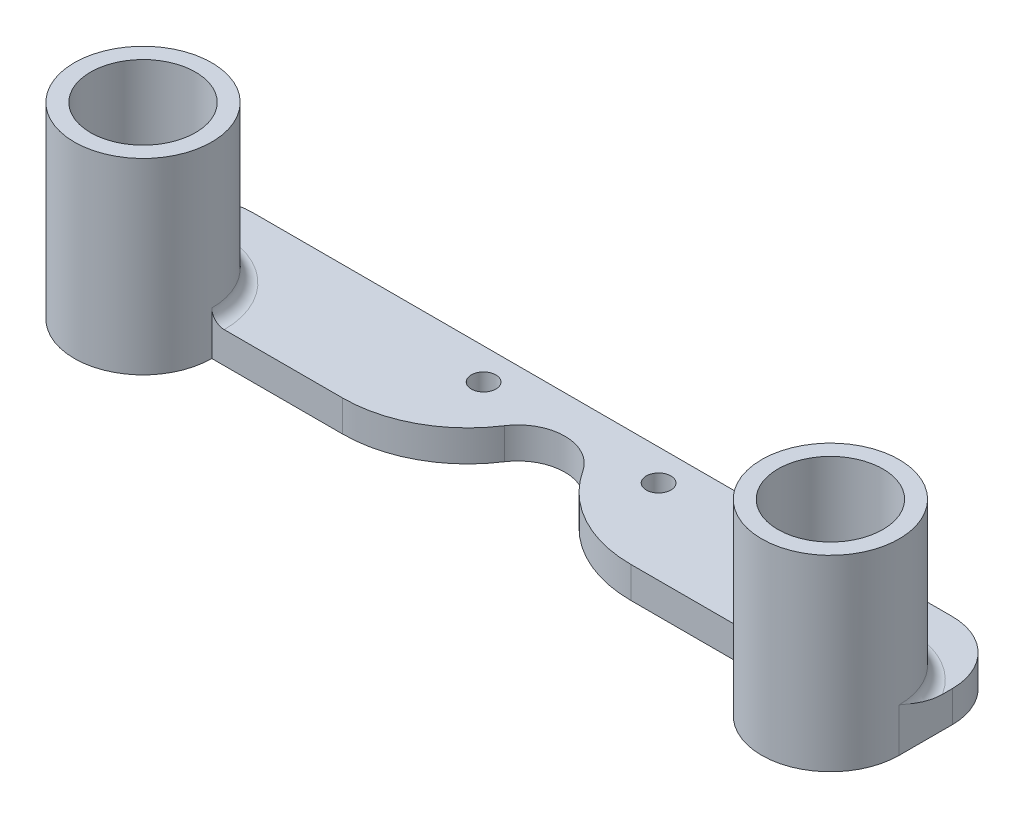
ISO-10303-21;
HEADER;
FILE_DESCRIPTION(('STEP AP214'),'2;1');
FILE_NAME('part.step','',(''),(''),'','','');
FILE_SCHEMA(('AUTOMOTIVE_DESIGN { 1 0 10303 214 1 1 1 1 }'));
ENDSEC;
DATA;
#1=APPLICATION_CONTEXT('core data for automotive mechanical design processes');
#2=APPLICATION_PROTOCOL_DEFINITION('international standard','automotive_design',2000,#1);
#3=PRODUCT_CONTEXT('',#1,'mechanical');
#4=PRODUCT('Part','Part','',(#3));
#5=PRODUCT_RELATED_PRODUCT_CATEGORY('part','',(#4));
#6=PRODUCT_DEFINITION_FORMATION('','',#4);
#7=PRODUCT_DEFINITION_CONTEXT('part definition',#1,'design');
#8=PRODUCT_DEFINITION('design','',#6,#7);
#9=PRODUCT_DEFINITION_SHAPE('','',#8);
#10=(LENGTH_UNIT() NAMED_UNIT(*) SI_UNIT(.MILLI.,.METRE.));
#11=(NAMED_UNIT(*) PLANE_ANGLE_UNIT() SI_UNIT($,.RADIAN.));
#12=(NAMED_UNIT(*) SI_UNIT($,.STERADIAN.) SOLID_ANGLE_UNIT());
#13=UNCERTAINTY_MEASURE_WITH_UNIT(LENGTH_MEASURE(1.E-05),#10,'distance_accuracy_value','');
#14=(GEOMETRIC_REPRESENTATION_CONTEXT(3) GLOBAL_UNCERTAINTY_ASSIGNED_CONTEXT((#13)) GLOBAL_UNIT_ASSIGNED_CONTEXT((#10,
#11,#12)) REPRESENTATION_CONTEXT('',''));
#15=CARTESIAN_POINT('',(0.,0.,0.));
#16=DIRECTION('',(0.,0.,1.));
#17=DIRECTION('',(1.,0.,0.));
#18=AXIS2_PLACEMENT_3D('',#15,#16,#17);
#19=CARTESIAN_POINT('',(45.9292860318092,6.35,-10.795));
#20=DIRECTION('',(0.,-1.,0.));
#21=DIRECTION('',(0.,0.,-1.));
#22=AXIS2_PLACEMENT_3D('',#19,#20,#21);
#23=PLANE('',#22);
#24=CARTESIAN_POINT('',(-7.41071396819081,6.35,-17.145));
#25=DIRECTION('',(0.,1.,0.));
#26=DIRECTION('',(0.,0.,1.));
#27=AXIS2_PLACEMENT_3D('',#24,#25,#26);
#28=CIRCLE('',#27,2.49999999999999);
#29=CARTESIAN_POINT('',(-7.41071396819081,6.35,-14.645));
#30=VERTEX_POINT('',#29);
#31=EDGE_CURVE('E330',#30,#30,#28,.T.);
#32=ORIENTED_EDGE('',*,*,#31,.F.);
#33=EDGE_LOOP('',(#32));
#34=FACE_BOUND('',#33,.T.);
#35=CARTESIAN_POINT('',(-42.9707139681908,6.35,-17.145));
#36=DIRECTION('',(0.,1.,0.));
#37=DIRECTION('',(0.,0.,1.));
#38=AXIS2_PLACEMENT_3D('',#35,#36,#37);
#39=CIRCLE('',#38,2.49999999999999);
#40=CARTESIAN_POINT('',(-42.9707139681908,6.35,-14.645));
#41=VERTEX_POINT('',#40);
#42=EDGE_CURVE('E334',#41,#41,#39,.T.);
#43=ORIENTED_EDGE('',*,*,#42,.F.);
#44=EDGE_LOOP('',(#43));
#45=FACE_BOUND('',#44,.T.);
#46=DIRECTION('',(0.,0.,1.));
#47=VECTOR('',#46,1.);
#48=CARTESIAN_POINT('',(-109.010713968191,6.35,0.));
#49=LINE('',#48,#47);
#50=CARTESIAN_POINT('',(-109.010713968191,6.35,-10.795));
#51=VERTEX_POINT('',#50);
#52=CARTESIAN_POINT('',(-109.010713968191,6.35,-8.79881810244988));
#53=VERTEX_POINT('',#52);
#54=EDGE_CURVE('E302',#51,#53,#49,.T.);
#55=ORIENTED_EDGE('',*,*,#54,.T.);
#56=CARTESIAN_POINT('',(-95.0407139681908,6.35,0.));
#57=DIRECTION('',(0.,-1.,0.));
#58=DIRECTION('',(0.,0.,-1.));
#59=AXIS2_PLACEMENT_3D('',#56,#57,#58);
#60=CIRCLE('',#59,16.51);
#61=CARTESIAN_POINT('',(-78.5307139681908,6.35,0.));
#62=VERTEX_POINT('',#61);
#63=EDGE_CURVE('E174',#53,#62,#60,.T.);
#64=ORIENTED_EDGE('',*,*,#63,.T.);
#65=DIRECTION('',(1.,0.,0.));
#66=VECTOR('',#65,1.);
#67=CARTESIAN_POINT('',(-81.0707139681908,6.35,0.));
#68=LINE('',#67,#66);
#69=CARTESIAN_POINT('',(-54.4627676200957,6.35,0.));
#70=VERTEX_POINT('',#69);
#71=EDGE_CURVE('E321',#62,#70,#68,.T.);
#72=ORIENTED_EDGE('',*,*,#71,.T.);
#73=CARTESIAN_POINT('',(-54.4627676200957,6.35,-25.4));
#74=DIRECTION('',(0.,1.,0.));
#75=DIRECTION('',(0.,0.,-1.));
#76=AXIS2_PLACEMENT_3D('',#73,#74,#75);
#77=CIRCLE('',#76,25.4);
#78=CARTESIAN_POINT('',(-33.1740013278012,6.35,-11.5454545454545));
#79=VERTEX_POINT('',#78);
#80=EDGE_CURVE('E265',#70,#79,#77,.T.);
#81=ORIENTED_EDGE('',*,*,#80,.T.);
#82=CARTESIAN_POINT('',(-25.1907139681908,6.35,-6.35));
#83=DIRECTION('',(0.,-1.,0.));
#84=DIRECTION('',(0.,0.,1.));
#85=AXIS2_PLACEMENT_3D('',#82,#83,#84);
#86=CIRCLE('',#85,9.525);
#87=CARTESIAN_POINT('',(-17.2074266085804,6.35,-11.5454545454545));
#88=VERTEX_POINT('',#87);
#89=EDGE_CURVE('E318',#79,#88,#86,.T.);
#90=ORIENTED_EDGE('',*,*,#89,.T.);
#91=CARTESIAN_POINT('',(4.0813396837141,6.35,-25.4));
#92=DIRECTION('',(0.,1.,0.));
#93=DIRECTION('',(0.,0.,1.));
#94=AXIS2_PLACEMENT_3D('',#91,#92,#93);
#95=CIRCLE('',#94,25.4);
#96=CARTESIAN_POINT('',(4.0813396837141,6.35,0.));
#97=VERTEX_POINT('',#96);
#98=EDGE_CURVE('E316',#88,#97,#95,.T.);
#99=ORIENTED_EDGE('',*,*,#98,.T.);
#100=DIRECTION('',(1.,0.,0.));
#101=VECTOR('',#100,1.);
#102=CARTESIAN_POINT('',(4.08133968371411,6.35,0.));
#103=LINE('',#102,#101);
#104=CARTESIAN_POINT('',(28.1492860318092,6.35,0.));
#105=VERTEX_POINT('',#104);
#106=EDGE_CURVE('E313',#97,#105,#103,.T.);
#107=ORIENTED_EDGE('',*,*,#106,.T.);
#108=CARTESIAN_POINT('',(44.6592860318092,6.35,0.));
#109=DIRECTION('',(0.,-1.,0.));
#110=DIRECTION('',(0.,0.,-1.));
#111=AXIS2_PLACEMENT_3D('',#108,#109,#110);
#112=CIRCLE('',#111,16.51);
#113=CARTESIAN_POINT('',(58.6292860318092,6.35,-8.7988181024499));
#114=VERTEX_POINT('',#113);
#115=EDGE_CURVE('E167',#105,#114,#112,.T.);
#116=ORIENTED_EDGE('',*,*,#115,.T.);
#117=DIRECTION('',(0.,0.,-1.));
#118=VECTOR('',#117,1.);
#119=CARTESIAN_POINT('',(58.6292860318092,6.35,0.));
#120=LINE('',#119,#118);
#121=CARTESIAN_POINT('',(58.6292860318092,6.35,-10.7949999999999));
#122=VERTEX_POINT('',#121);
#123=EDGE_CURVE('E155',#114,#122,#120,.T.);
#124=ORIENTED_EDGE('',*,*,#123,.T.);
#125=CARTESIAN_POINT('',(45.9292860318092,6.35,-10.795));
#126=DIRECTION('',(0.,1.,0.));
#127=DIRECTION('',(0.,0.,-1.));
#128=AXIS2_PLACEMENT_3D('',#125,#126,#127);
#129=CIRCLE('',#128,12.7);
#130=CARTESIAN_POINT('',(45.9292860318091,6.35,-23.495));
#131=VERTEX_POINT('',#130);
#132=EDGE_CURVE('E150',#122,#131,#129,.T.);
#133=ORIENTED_EDGE('',*,*,#132,.T.);
#134=DIRECTION('',(-1.,0.,0.));
#135=VECTOR('',#134,1.);
#136=CARTESIAN_POINT('',(-96.3107139681908,6.35,-23.495));
#137=LINE('',#136,#135);
#138=CARTESIAN_POINT('',(-96.3107139681908,6.35,-23.495));
#139=VERTEX_POINT('',#138);
#140=EDGE_CURVE('E139',#131,#139,#137,.T.);
#141=ORIENTED_EDGE('',*,*,#140,.T.);
#142=CARTESIAN_POINT('',(-96.3107139681908,6.35,-10.795));
#143=DIRECTION('',(0.,1.,0.));
#144=DIRECTION('',(0.,0.,-1.));
#145=AXIS2_PLACEMENT_3D('',#142,#143,#144);
#146=CIRCLE('',#145,12.7);
#147=EDGE_CURVE('E149',#139,#51,#146,.T.);
#148=ORIENTED_EDGE('',*,*,#147,.T.);
#149=EDGE_LOOP('',(#55,#64,#72,#81,#90,#99,#107,#116,#124,#133,#141,#148));
#150=FACE_BOUND('',#149,.T.);
#151=ADVANCED_FACE('F33',(#34,#45,#150),#23,.F.);
#152=CARTESIAN_POINT('',(45.9292860318092,0.,-10.795));
#153=DIRECTION('',(0.,-1.,0.));
#154=DIRECTION('',(0.,0.,-1.));
#155=AXIS2_PLACEMENT_3D('',#152,#153,#154);
#156=PLANE('',#155);
#157=CARTESIAN_POINT('',(-7.41071396819081,0.,-17.145));
#158=DIRECTION('',(0.,1.,0.));
#159=DIRECTION('',(0.,0.,1.));
#160=AXIS2_PLACEMENT_3D('',#157,#158,#159);
#161=CIRCLE('',#160,2.49999999999999);
#162=CARTESIAN_POINT('',(-7.41071396819081,0.,-14.645));
#163=VERTEX_POINT('',#162);
#164=EDGE_CURVE('E331',#163,#163,#161,.T.);
#165=ORIENTED_EDGE('',*,*,#164,.T.);
#166=EDGE_LOOP('',(#165));
#167=FACE_BOUND('',#166,.T.);
#168=CARTESIAN_POINT('',(-95.0407139681908,0.,0.));
#169=DIRECTION('',(0.,1.,0.));
#170=DIRECTION('',(0.,0.,1.));
#171=AXIS2_PLACEMENT_3D('',#168,#169,#170);
#172=CIRCLE('',#171,10.668);
#173=CARTESIAN_POINT('',(-95.0407139681908,0.,10.668));
#174=VERTEX_POINT('',#173);
#175=EDGE_CURVE('E311',#174,#174,#172,.T.);
#176=ORIENTED_EDGE('',*,*,#175,.T.);
#177=EDGE_LOOP('',(#176));
#178=FACE_BOUND('',#177,.T.);
#179=CARTESIAN_POINT('',(45.9292860318092,0.,-10.795));
#180=DIRECTION('',(0.,1.,0.));
#181=DIRECTION('',(0.,0.,-1.));
#182=AXIS2_PLACEMENT_3D('',#179,#180,#181);
#183=CIRCLE('',#182,12.7);
#184=CARTESIAN_POINT('',(58.6292860318092,0.,-10.7949999999999));
#185=VERTEX_POINT('',#184);
#186=CARTESIAN_POINT('',(45.9292860318091,0.,-23.495));
#187=VERTEX_POINT('',#186);
#188=EDGE_CURVE('E163',#185,#187,#183,.T.);
#189=ORIENTED_EDGE('',*,*,#188,.F.);
#190=DIRECTION('',(0.,0.,-1.));
#191=VECTOR('',#190,1.);
#192=CARTESIAN_POINT('',(58.6292860318092,0.,0.));
#193=LINE('',#192,#191);
#194=CARTESIAN_POINT('',(58.6292860318092,0.,0.));
#195=VERTEX_POINT('',#194);
#196=EDGE_CURVE('E159',#195,#185,#193,.T.);
#197=ORIENTED_EDGE('',*,*,#196,.F.);
#198=CARTESIAN_POINT('',(44.6592860318092,0.,0.));
#199=DIRECTION('',(0.,1.,0.));
#200=DIRECTION('',(0.,0.,1.));
#201=AXIS2_PLACEMENT_3D('',#198,#199,#200);
#202=CIRCLE('',#201,13.97);
#203=CARTESIAN_POINT('',(30.6892860318092,0.,0.));
#204=VERTEX_POINT('',#203);
#205=EDGE_CURVE('E280',#204,#195,#202,.T.);
#206=ORIENTED_EDGE('',*,*,#205,.F.);
#207=DIRECTION('',(1.,0.,0.));
#208=VECTOR('',#207,1.);
#209=CARTESIAN_POINT('',(4.08133968371411,0.,0.));
#210=LINE('',#209,#208);
#211=CARTESIAN_POINT('',(4.0813396837141,0.,0.));
#212=VERTEX_POINT('',#211);
#213=EDGE_CURVE('E278',#212,#204,#210,.T.);
#214=ORIENTED_EDGE('',*,*,#213,.F.);
#215=CARTESIAN_POINT('',(4.0813396837141,0.,-25.4));
#216=DIRECTION('',(0.,1.,0.));
#217=DIRECTION('',(0.,0.,1.));
#218=AXIS2_PLACEMENT_3D('',#215,#216,#217);
#219=CIRCLE('',#218,25.4);
#220=CARTESIAN_POINT('',(-17.2074266085804,0.,-11.5454545454545));
#221=VERTEX_POINT('',#220);
#222=EDGE_CURVE('E273',#221,#212,#219,.T.);
#223=ORIENTED_EDGE('',*,*,#222,.F.);
#224=CARTESIAN_POINT('',(-25.1907139681908,0.,-6.35));
#225=DIRECTION('',(0.,-1.,0.));
#226=DIRECTION('',(0.,0.,1.));
#227=AXIS2_PLACEMENT_3D('',#224,#225,#226);
#228=CIRCLE('',#227,9.525);
#229=CARTESIAN_POINT('',(-33.1740013278012,0.,-11.5454545454545));
#230=VERTEX_POINT('',#229);
#231=EDGE_CURVE('E271',#230,#221,#228,.T.);
#232=ORIENTED_EDGE('',*,*,#231,.F.);
#233=CARTESIAN_POINT('',(-54.4627676200957,0.,-25.4));
#234=DIRECTION('',(0.,1.,0.));
#235=DIRECTION('',(0.,0.,-1.));
#236=AXIS2_PLACEMENT_3D('',#233,#234,#235);
#237=CIRCLE('',#236,25.4);
#238=CARTESIAN_POINT('',(-54.4627676200957,0.,0.));
#239=VERTEX_POINT('',#238);
#240=EDGE_CURVE('E260',#239,#230,#237,.T.);
#241=ORIENTED_EDGE('',*,*,#240,.F.);
#242=DIRECTION('',(1.,0.,0.));
#243=VECTOR('',#242,1.);
#244=CARTESIAN_POINT('',(-81.0707139681908,0.,0.));
#245=LINE('',#244,#243);
#246=CARTESIAN_POINT('',(-81.0707139681908,0.,0.));
#247=VERTEX_POINT('',#246);
#248=EDGE_CURVE('E250',#247,#239,#245,.T.);
#249=ORIENTED_EDGE('',*,*,#248,.F.);
#250=CARTESIAN_POINT('',(-95.0407139681908,0.,0.));
#251=DIRECTION('',(0.,1.,0.));
#252=DIRECTION('',(0.,0.,1.));
#253=AXIS2_PLACEMENT_3D('',#250,#251,#252);
#254=CIRCLE('',#253,13.97);
#255=CARTESIAN_POINT('',(-109.010713968191,0.,0.));
#256=VERTEX_POINT('',#255);
#257=EDGE_CURVE('E261',#256,#247,#254,.T.);
#258=ORIENTED_EDGE('',*,*,#257,.F.);
#259=DIRECTION('',(0.,0.,1.));
#260=VECTOR('',#259,1.);
#261=CARTESIAN_POINT('',(-109.010713968191,0.,0.));
#262=LINE('',#261,#260);
#263=CARTESIAN_POINT('',(-109.010713968191,0.,-10.795));
#264=VERTEX_POINT('',#263);
#265=EDGE_CURVE('E301',#264,#256,#262,.T.);
#266=ORIENTED_EDGE('',*,*,#265,.F.);
#267=CARTESIAN_POINT('',(-96.3107139681908,0.,-10.795));
#268=DIRECTION('',(0.,1.,0.));
#269=DIRECTION('',(0.,0.,-1.));
#270=AXIS2_PLACEMENT_3D('',#267,#268,#269);
#271=CIRCLE('',#270,12.7);
#272=CARTESIAN_POINT('',(-96.3107139681908,0.,-23.495));
#273=VERTEX_POINT('',#272);
#274=EDGE_CURVE('E304',#273,#264,#271,.T.);
#275=ORIENTED_EDGE('',*,*,#274,.F.);
#276=DIRECTION('',(-1.,0.,0.));
#277=VECTOR('',#276,1.);
#278=CARTESIAN_POINT('',(-96.3107139681908,0.,-23.495));
#279=LINE('',#278,#277);
#280=EDGE_CURVE('E306',#187,#273,#279,.T.);
#281=ORIENTED_EDGE('',*,*,#280,.F.);
#282=EDGE_LOOP('',(#189,#197,#206,#214,#223,#232,#241,#249,#258,#266,#275,#281));
#283=FACE_BOUND('',#282,.T.);
#284=CARTESIAN_POINT('',(44.6592860318092,0.,0.));
#285=DIRECTION('',(0.,1.,0.));
#286=DIRECTION('',(0.,0.,1.));
#287=AXIS2_PLACEMENT_3D('',#284,#285,#286);
#288=CIRCLE('',#287,10.668);
#289=CARTESIAN_POINT('',(44.6592860318092,0.,10.668));
#290=VERTEX_POINT('',#289);
#291=EDGE_CURVE('E327',#290,#290,#288,.T.);
#292=ORIENTED_EDGE('',*,*,#291,.T.);
#293=EDGE_LOOP('',(#292));
#294=FACE_BOUND('',#293,.T.);
#295=CARTESIAN_POINT('',(-42.9707139681908,0.,-17.145));
#296=DIRECTION('',(0.,1.,0.));
#297=DIRECTION('',(0.,0.,1.));
#298=AXIS2_PLACEMENT_3D('',#295,#296,#297);
#299=CIRCLE('',#298,2.49999999999999);
#300=CARTESIAN_POINT('',(-42.9707139681908,0.,-14.645));
#301=VERTEX_POINT('',#300);
#302=EDGE_CURVE('E337',#301,#301,#299,.T.);
#303=ORIENTED_EDGE('',*,*,#302,.T.);
#304=EDGE_LOOP('',(#303));
#305=FACE_BOUND('',#304,.T.);
#306=ADVANCED_FACE('F202',(#167,#178,#283,#294,#305),#156,.T.);
#307=CARTESIAN_POINT('',(45.9292860318092,6.35,-10.795));
#308=DIRECTION('',(0.,-1.,0.));
#309=DIRECTION('',(0.,0.,-1.));
#310=AXIS2_PLACEMENT_3D('',#307,#308,#309);
#311=CYLINDRICAL_SURFACE('',#310,12.7);
#312=ORIENTED_EDGE('',*,*,#188,.T.);
#313=DIRECTION('',(0.,-1.,0.));
#314=VECTOR('',#313,1.);
#315=CARTESIAN_POINT('',(45.9292860318091,6.35,-23.495));
#316=LINE('',#315,#314);
#317=EDGE_CURVE('E143',#131,#187,#316,.T.);
#318=ORIENTED_EDGE('',*,*,#317,.F.);
#319=ORIENTED_EDGE('',*,*,#132,.F.);
#320=DIRECTION('',(0.,-1.,0.));
#321=VECTOR('',#320,1.);
#322=CARTESIAN_POINT('',(58.6292860318092,6.35,-10.7949999999999));
#323=LINE('',#322,#321);
#324=EDGE_CURVE('E283',#122,#185,#323,.T.);
#325=ORIENTED_EDGE('',*,*,#324,.T.);
#326=EDGE_LOOP('',(#312,#318,#319,#325));
#327=FACE_BOUND('',#326,.T.);
#328=ADVANCED_FACE('F161',(#327),#311,.T.);
#329=CARTESIAN_POINT('',(-96.3107139681908,6.35,-23.495));
#330=DIRECTION('',(0.,0.,1.));
#331=DIRECTION('',(1.,0.,0.));
#332=AXIS2_PLACEMENT_3D('',#329,#330,#331);
#333=PLANE('',#332);
#334=ORIENTED_EDGE('',*,*,#280,.T.);
#335=DIRECTION('',(0.,-1.,0.));
#336=VECTOR('',#335,1.);
#337=CARTESIAN_POINT('',(-96.3107139681908,6.35,-23.495));
#338=LINE('',#337,#336);
#339=EDGE_CURVE('E146',#139,#273,#338,.T.);
#340=ORIENTED_EDGE('',*,*,#339,.F.);
#341=ORIENTED_EDGE('',*,*,#140,.F.);
#342=ORIENTED_EDGE('',*,*,#317,.T.);
#343=EDGE_LOOP('',(#334,#340,#341,#342));
#344=FACE_BOUND('',#343,.T.);
#345=ADVANCED_FACE('F141',(#344),#333,.F.);
#346=CARTESIAN_POINT('',(-96.3107139681908,6.35,-10.795));
#347=DIRECTION('',(0.,-1.,0.));
#348=DIRECTION('',(0.,0.,-1.));
#349=AXIS2_PLACEMENT_3D('',#346,#347,#348);
#350=CYLINDRICAL_SURFACE('',#349,12.7);
#351=ORIENTED_EDGE('',*,*,#274,.T.);
#352=DIRECTION('',(0.,-1.,0.));
#353=VECTOR('',#352,1.);
#354=CARTESIAN_POINT('',(-109.010713968191,6.35,-10.795));
#355=LINE('',#354,#353);
#356=EDGE_CURVE('E169',#51,#264,#355,.T.);
#357=ORIENTED_EDGE('',*,*,#356,.F.);
#358=ORIENTED_EDGE('',*,*,#147,.F.);
#359=ORIENTED_EDGE('',*,*,#339,.T.);
#360=EDGE_LOOP('',(#351,#357,#358,#359));
#361=FACE_BOUND('',#360,.T.);
#362=ADVANCED_FACE('F194',(#361),#350,.T.);
#363=CARTESIAN_POINT('',(-109.010713968191,6.35,0.));
#364=DIRECTION('',(1.,0.,0.));
#365=DIRECTION('',(0.,0.,-1.));
#366=AXIS2_PLACEMENT_3D('',#363,#364,#365);
#367=PLANE('',#366);
#368=ORIENTED_EDGE('',*,*,#265,.T.);
#369=DIRECTION('',(0.,-1.,0.));
#370=VECTOR('',#369,1.);
#371=CARTESIAN_POINT('',(-109.010713968191,6.35,0.));
#372=LINE('',#371,#370);
#373=CARTESIAN_POINT('',(-109.010713968191,8.89,0.));
#374=VERTEX_POINT('',#373);
#375=EDGE_CURVE('E295',#374,#256,#372,.T.);
#376=ORIENTED_EDGE('',*,*,#375,.F.);
#377=CARTESIAN_POINT('',(-109.010713968191,6.35,-8.79881810244988));
#378=CARTESIAN_POINT('',(-109.010713968191,6.35002487646464,-8.63132472371769));
#379=CARTESIAN_POINT('',(-109.010713968191,6.35470403251427,-8.46388592691658));
#380=CARTESIAN_POINT('',(-109.010713968191,6.3724008065403,-8.12954044360044));
#381=CARTESIAN_POINT('',(-109.010713968191,6.38541351869821,-7.96263350204791));
#382=CARTESIAN_POINT('',(-109.010713968191,6.41876299309983,-7.63004178764187));
#383=CARTESIAN_POINT('',(-109.010713968191,6.43907920747222,-7.46435490366782));
#384=CARTESIAN_POINT('',(-109.010713968191,6.48624160564604,-7.13389802235505));
#385=CARTESIAN_POINT('',(-109.010713968191,6.51308885157576,-6.96912817861548));
#386=CARTESIAN_POINT('',(-109.010713968191,6.60170538409264,-6.47982286822378));
#387=CARTESIAN_POINT('',(-109.010713968191,6.67193103699459,-6.15680650861605));
#388=CARTESIAN_POINT('',(-109.010713968191,6.83038340293944,-5.51506227473233));
#389=CARTESIAN_POINT('',(-109.010713968191,6.91862483309211,-5.19633813514266));
#390=CARTESIAN_POINT('',(-109.010713968191,7.13878024738053,-4.46481700957931));
#391=CARTESIAN_POINT('',(-109.010713968191,7.2757457050279,-4.05355244978293));
#392=CARTESIAN_POINT('',(-109.010713968191,7.56661269566496,-3.2370183161603));
#393=CARTESIAN_POINT('',(-109.010713968191,7.72052009313719,-2.83175087366414));
#394=CARTESIAN_POINT('',(-109.010713968191,8.19907839176432,-1.62050381116587));
#395=CARTESIAN_POINT('',(-109.010713968191,8.53991406919799,-0.821025609077069));
#396=CARTESIAN_POINT('',(-109.010713968191,8.88381871118719,-0.014496438405331));
#397=CARTESIAN_POINT('',(-109.010713968191,8.88690936452759,-0.00724821424486186));
#398=CARTESIAN_POINT('',(-109.010713968191,8.89,0.));
#399=B_SPLINE_CURVE_WITH_KNOTS('',3,(#377,#378,#379,#380,#381,#382,#383,#384,#385,#386,#387,
#388,#389,#390,#391,#392,#393,#394,#395,#396,#397,#398),.UNSPECIFIED.,.F.,.F.,(4,2,2,2,2,2,2,2,
2,2,4),(0.,0.502337009441554,1.00437857337458,1.50501859432424,2.00574008782978,
2.99669091501382,3.9884545135848,5.28829216244531,6.58858117576368,9.19530524569646,
9.2189441966038),.UNSPECIFIED.);
#400=EDGE_CURVE('E178',#374,#53,#399,.F.);
#401=ORIENTED_EDGE('',*,*,#400,.T.);
#402=ORIENTED_EDGE('',*,*,#54,.F.);
#403=ORIENTED_EDGE('',*,*,#356,.T.);
#404=EDGE_LOOP('',(#368,#376,#401,#402,#403));
#405=FACE_BOUND('',#404,.T.);
#406=ADVANCED_FACE('F188',(#405),#367,.F.);
#407=CARTESIAN_POINT('',(-95.0407139681908,6.35,0.));
#408=DIRECTION('',(0.,-1.,0.));
#409=DIRECTION('',(0.,0.,-1.));
#410=AXIS2_PLACEMENT_3D('',#407,#408,#409);
#411=CYLINDRICAL_SURFACE('',#410,13.97);
#412=CARTESIAN_POINT('',(-95.0407139681908,8.89,0.));
#413=DIRECTION('',(0.,-1.,0.));
#414=DIRECTION('',(0.,0.,-1.));
#415=AXIS2_PLACEMENT_3D('',#412,#413,#414);
#416=CIRCLE('',#415,13.97);
#417=CARTESIAN_POINT('',(-81.0707139681908,8.89,0.));
#418=VERTEX_POINT('',#417);
#419=EDGE_CURVE('E164',#418,#374,#416,.F.);
#420=ORIENTED_EDGE('',*,*,#419,.T.);
#421=ORIENTED_EDGE('',*,*,#375,.T.);
#422=ORIENTED_EDGE('',*,*,#257,.T.);
#423=DIRECTION('',(0.,-1.,0.));
#424=VECTOR('',#423,1.);
#425=CARTESIAN_POINT('',(-81.0707139681908,6.35,0.));
#426=LINE('',#425,#424);
#427=EDGE_CURVE('E256',#418,#247,#426,.T.);
#428=ORIENTED_EDGE('',*,*,#427,.F.);
#429=EDGE_LOOP('',(#420,#421,#422,#428));
#430=FACE_BOUND('',#429,.T.);
#431=CARTESIAN_POINT('',(-95.0407139681908,38.1,0.));
#432=DIRECTION('',(0.,1.,0.));
#433=DIRECTION('',(0.,0.,1.));
#434=AXIS2_PLACEMENT_3D('',#431,#432,#433);
#435=CIRCLE('',#434,13.97);
#436=CARTESIAN_POINT('',(-95.0407139681908,38.1,13.97));
#437=VERTEX_POINT('',#436);
#438=EDGE_CURVE('E340',#437,#437,#435,.T.);
#439=ORIENTED_EDGE('',*,*,#438,.F.);
#440=EDGE_LOOP('',(#439));
#441=FACE_BOUND('',#440,.T.);
#442=ADVANCED_FACE('F193',(#430,#441),#411,.T.);
#443=CARTESIAN_POINT('',(-81.0707139681908,6.35,0.));
#444=DIRECTION('',(0.,0.,-1.));
#445=DIRECTION('',(-1.,0.,0.));
#446=AXIS2_PLACEMENT_3D('',#443,#444,#445);
#447=PLANE('',#446);
#448=ORIENTED_EDGE('',*,*,#248,.T.);
#449=DIRECTION('',(0.,-1.,0.));
#450=VECTOR('',#449,1.);
#451=CARTESIAN_POINT('',(-54.4627676200957,6.35,0.));
#452=LINE('',#451,#450);
#453=EDGE_CURVE('E253',#70,#239,#452,.T.);
#454=ORIENTED_EDGE('',*,*,#453,.F.);
#455=ORIENTED_EDGE('',*,*,#71,.F.);
#456=CARTESIAN_POINT('',(-78.5307139681908,8.89,0.));
#457=DIRECTION('',(0.,0.,-1.));
#458=DIRECTION('',(-1.,0.,0.));
#459=AXIS2_PLACEMENT_3D('',#456,#457,#458);
#460=CIRCLE('',#459,2.54);
#461=EDGE_CURVE('E184',#62,#418,#460,.T.);
#462=ORIENTED_EDGE('',*,*,#461,.T.);
#463=ORIENTED_EDGE('',*,*,#427,.T.);
#464=EDGE_LOOP('',(#448,#454,#455,#462,#463));
#465=FACE_BOUND('',#464,.T.);
#466=ADVANCED_FACE('F239',(#465),#447,.F.);
#467=CARTESIAN_POINT('',(-54.4627676200957,6.35,-25.4));
#468=DIRECTION('',(0.,-1.,0.));
#469=DIRECTION('',(0.,0.,-1.));
#470=AXIS2_PLACEMENT_3D('',#467,#468,#469);
#471=CYLINDRICAL_SURFACE('',#470,25.4);
#472=ORIENTED_EDGE('',*,*,#240,.T.);
#473=DIRECTION('',(0.,-1.,0.));
#474=VECTOR('',#473,1.);
#475=CARTESIAN_POINT('',(-33.1740013278012,6.35,-11.5454545454545));
#476=LINE('',#475,#474);
#477=EDGE_CURVE('E266',#79,#230,#476,.T.);
#478=ORIENTED_EDGE('',*,*,#477,.F.);
#479=ORIENTED_EDGE('',*,*,#80,.F.);
#480=ORIENTED_EDGE('',*,*,#453,.T.);
#481=EDGE_LOOP('',(#472,#478,#479,#480));
#482=FACE_BOUND('',#481,.T.);
#483=ADVANCED_FACE('F236',(#482),#471,.T.);
#484=CARTESIAN_POINT('',(-25.1907139681908,6.35,-6.35));
#485=DIRECTION('',(0.,-1.,0.));
#486=DIRECTION('',(0.,0.,-1.));
#487=AXIS2_PLACEMENT_3D('',#484,#485,#486);
#488=CYLINDRICAL_SURFACE('',#487,9.525);
#489=ORIENTED_EDGE('',*,*,#231,.T.);
#490=DIRECTION('',(0.,-1.,0.));
#491=VECTOR('',#490,1.);
#492=CARTESIAN_POINT('',(-17.2074266085804,6.35,-11.5454545454545));
#493=LINE('',#492,#491);
#494=EDGE_CURVE('E290',#88,#221,#493,.T.);
#495=ORIENTED_EDGE('',*,*,#494,.F.);
#496=ORIENTED_EDGE('',*,*,#89,.F.);
#497=ORIENTED_EDGE('',*,*,#477,.T.);
#498=EDGE_LOOP('',(#489,#495,#496,#497));
#499=FACE_BOUND('',#498,.T.);
#500=ADVANCED_FACE('F232',(#499),#488,.F.);
#501=CARTESIAN_POINT('',(4.0813396837141,6.35,-25.4));
#502=DIRECTION('',(0.,-1.,0.));
#503=DIRECTION('',(0.,0.,-1.));
#504=AXIS2_PLACEMENT_3D('',#501,#502,#503);
#505=CYLINDRICAL_SURFACE('',#504,25.4);
#506=ORIENTED_EDGE('',*,*,#222,.T.);
#507=DIRECTION('',(0.,-1.,0.));
#508=VECTOR('',#507,1.);
#509=CARTESIAN_POINT('',(4.0813396837141,6.35,0.));
#510=LINE('',#509,#508);
#511=EDGE_CURVE('E287',#97,#212,#510,.T.);
#512=ORIENTED_EDGE('',*,*,#511,.F.);
#513=ORIENTED_EDGE('',*,*,#98,.F.);
#514=ORIENTED_EDGE('',*,*,#494,.T.);
#515=EDGE_LOOP('',(#506,#512,#513,#514));
#516=FACE_BOUND('',#515,.T.);
#517=ADVANCED_FACE('F229',(#516),#505,.T.);
#518=CARTESIAN_POINT('',(4.08133968371411,6.35,0.));
#519=DIRECTION('',(0.,0.,-1.));
#520=DIRECTION('',(-1.,0.,0.));
#521=AXIS2_PLACEMENT_3D('',#518,#519,#520);
#522=PLANE('',#521);
#523=ORIENTED_EDGE('',*,*,#213,.T.);
#524=DIRECTION('',(0.,-1.,0.));
#525=VECTOR('',#524,1.);
#526=CARTESIAN_POINT('',(30.6892860318092,6.35,0.));
#527=LINE('',#526,#525);
#528=CARTESIAN_POINT('',(30.6892860318092,8.89,0.));
#529=VERTEX_POINT('',#528);
#530=EDGE_CURVE('E53',#529,#204,#527,.T.);
#531=ORIENTED_EDGE('',*,*,#530,.F.);
#532=CARTESIAN_POINT('',(28.1492860318092,8.89,0.));
#533=DIRECTION('',(0.,0.,-1.));
#534=DIRECTION('',(-1.,0.,0.));
#535=AXIS2_PLACEMENT_3D('',#532,#533,#534);
#536=CIRCLE('',#535,2.54);
#537=EDGE_CURVE('E46',#529,#105,#536,.T.);
#538=ORIENTED_EDGE('',*,*,#537,.T.);
#539=ORIENTED_EDGE('',*,*,#106,.F.);
#540=ORIENTED_EDGE('',*,*,#511,.T.);
#541=EDGE_LOOP('',(#523,#531,#538,#539,#540));
#542=FACE_BOUND('',#541,.T.);
#543=ADVANCED_FACE('F226',(#542),#522,.F.);
#544=CARTESIAN_POINT('',(44.6592860318092,6.35,0.));
#545=DIRECTION('',(0.,-1.,0.));
#546=DIRECTION('',(0.,0.,-1.));
#547=AXIS2_PLACEMENT_3D('',#544,#545,#546);
#548=CYLINDRICAL_SURFACE('',#547,13.97);
#549=CARTESIAN_POINT('',(44.6592860318092,8.89,0.));
#550=DIRECTION('',(0.,-1.,0.));
#551=DIRECTION('',(0.,0.,-1.));
#552=AXIS2_PLACEMENT_3D('',#549,#550,#551);
#553=CIRCLE('',#552,13.97);
#554=CARTESIAN_POINT('',(58.6292860318092,8.89,0.));
#555=VERTEX_POINT('',#554);
#556=EDGE_CURVE('E176',#555,#529,#553,.F.);
#557=ORIENTED_EDGE('',*,*,#556,.T.);
#558=ORIENTED_EDGE('',*,*,#530,.T.);
#559=ORIENTED_EDGE('',*,*,#205,.T.);
#560=DIRECTION('',(0.,-1.,0.));
#561=VECTOR('',#560,1.);
#562=CARTESIAN_POINT('',(58.6292860318092,6.35,0.));
#563=LINE('',#562,#561);
#564=EDGE_CURVE('E61',#555,#195,#563,.T.);
#565=ORIENTED_EDGE('',*,*,#564,.F.);
#566=EDGE_LOOP('',(#557,#558,#559,#565));
#567=FACE_BOUND('',#566,.T.);
#568=CARTESIAN_POINT('',(44.6592860318092,38.1,0.));
#569=DIRECTION('',(0.,1.,0.));
#570=DIRECTION('',(0.,0.,1.));
#571=AXIS2_PLACEMENT_3D('',#568,#569,#570);
#572=CIRCLE('',#571,13.97);
#573=CARTESIAN_POINT('',(44.6592860318092,38.1,13.97));
#574=VERTEX_POINT('',#573);
#575=EDGE_CURVE('E348',#574,#574,#572,.T.);
#576=ORIENTED_EDGE('',*,*,#575,.F.);
#577=EDGE_LOOP('',(#576));
#578=FACE_BOUND('',#577,.T.);
#579=ADVANCED_FACE('F222',(#567,#578),#548,.T.);
#580=CARTESIAN_POINT('',(58.6292860318092,6.35,0.));
#581=DIRECTION('',(-1.,0.,0.));
#582=DIRECTION('',(0.,0.,1.));
#583=AXIS2_PLACEMENT_3D('',#580,#581,#582);
#584=PLANE('',#583);
#585=ORIENTED_EDGE('',*,*,#196,.T.);
#586=ORIENTED_EDGE('',*,*,#324,.F.);
#587=ORIENTED_EDGE('',*,*,#123,.F.);
#588=CARTESIAN_POINT('',(58.6292860318092,6.35,-8.7988181024499));
#589=CARTESIAN_POINT('',(58.6292860318092,6.35002487646464,-8.63132472371771));
#590=CARTESIAN_POINT('',(58.6292860318092,6.35470403251427,-8.46388592691659));
#591=CARTESIAN_POINT('',(58.6292860318092,6.3724008065403,-8.12954044360045));
#592=CARTESIAN_POINT('',(58.6292860318092,6.38541351869821,-7.96263350204792));
#593=CARTESIAN_POINT('',(58.6292860318092,6.41876299309983,-7.63004178764188));
#594=CARTESIAN_POINT('',(58.6292860318092,6.43907920747222,-7.46435490366782));
#595=CARTESIAN_POINT('',(58.6292860318092,6.48624160564604,-7.13389802235506));
#596=CARTESIAN_POINT('',(58.6292860318092,6.51308885157576,-6.96912817861548));
#597=CARTESIAN_POINT('',(58.6292860318092,6.60170538409264,-6.47982286822378));
#598=CARTESIAN_POINT('',(58.6292860318092,6.6719310369946,-6.15680650861605));
#599=CARTESIAN_POINT('',(58.6292860318092,6.83038340293944,-5.51506227473234));
#600=CARTESIAN_POINT('',(58.6292860318092,6.91862483309211,-5.19633813514267));
#601=CARTESIAN_POINT('',(58.6292860318092,7.13878024738054,-4.46481700957932));
#602=CARTESIAN_POINT('',(58.6292860318092,7.2757457050279,-4.05355244978295));
#603=CARTESIAN_POINT('',(58.6292860318092,7.56661269566495,-3.23701831616032));
#604=CARTESIAN_POINT('',(58.6292860318092,7.72052009313719,-2.83175087366415));
#605=CARTESIAN_POINT('',(58.6292860318092,8.19907839176434,-1.6205038111659));
#606=CARTESIAN_POINT('',(58.6292860318092,8.53991406919806,-0.821025609077123));
#607=CARTESIAN_POINT('',(58.6292860318092,8.88381871118719,-0.0144964384053522));
#608=CARTESIAN_POINT('',(58.6292860318092,8.88690936452759,-0.00724821424488248));
#609=CARTESIAN_POINT('',(58.6292860318092,8.89,0.));
#610=B_SPLINE_CURVE_WITH_KNOTS('',3,(#588,#589,#590,#591,#592,#593,#594,#595,#596,#597,#598,
#599,#600,#601,#602,#603,#604,#605,#606,#607,#608,#609),.UNSPECIFIED.,.F.,.F.,(4,2,2,2,2,2,2,2,
2,2,4),(0.,0.502337009441556,1.00437857337458,1.50501859432425,2.0057400878298,2.99669091501383,
3.98845451358481,5.28829216244531,6.58858117576367,9.19530524569646,9.2189441966038),.UNSPECIFIED.);
#611=EDGE_CURVE('E11',#114,#555,#610,.T.);
#612=ORIENTED_EDGE('',*,*,#611,.T.);
#613=ORIENTED_EDGE('',*,*,#564,.T.);
#614=EDGE_LOOP('',(#585,#586,#587,#612,#613));
#615=FACE_BOUND('',#614,.T.);
#616=ADVANCED_FACE('F218',(#615),#584,.F.);
#617=CARTESIAN_POINT('',(-95.0407139681908,6.35,0.));
#618=DIRECTION('',(0.,-1.,0.));
#619=DIRECTION('',(0.,0.,-1.));
#620=AXIS2_PLACEMENT_3D('',#617,#618,#619);
#621=CYLINDRICAL_SURFACE('',#620,10.668);
#622=ORIENTED_EDGE('',*,*,#175,.F.);
#623=EDGE_LOOP('',(#622));
#624=FACE_BOUND('',#623,.T.);
#625=CARTESIAN_POINT('',(-95.0407139681908,38.1,0.));
#626=DIRECTION('',(0.,1.,0.));
#627=DIRECTION('',(0.,0.,1.));
#628=AXIS2_PLACEMENT_3D('',#625,#626,#627);
#629=CIRCLE('',#628,10.668);
#630=CARTESIAN_POINT('',(-95.0407139681908,38.1,10.668));
#631=VERTEX_POINT('',#630);
#632=EDGE_CURVE('E345',#631,#631,#629,.T.);
#633=ORIENTED_EDGE('',*,*,#632,.T.);
#634=EDGE_LOOP('',(#633));
#635=FACE_BOUND('',#634,.T.);
#636=ADVANCED_FACE('F216',(#624,#635),#621,.F.);
#637=CARTESIAN_POINT('',(44.6592860318092,6.35,0.));
#638=DIRECTION('',(0.,-1.,0.));
#639=DIRECTION('',(0.,0.,-1.));
#640=AXIS2_PLACEMENT_3D('',#637,#638,#639);
#641=CYLINDRICAL_SURFACE('',#640,10.668);
#642=ORIENTED_EDGE('',*,*,#291,.F.);
#643=EDGE_LOOP('',(#642));
#644=FACE_BOUND('',#643,.T.);
#645=CARTESIAN_POINT('',(44.6592860318092,38.1,0.));
#646=DIRECTION('',(0.,1.,0.));
#647=DIRECTION('',(0.,0.,1.));
#648=AXIS2_PLACEMENT_3D('',#645,#646,#647);
#649=CIRCLE('',#648,10.668);
#650=CARTESIAN_POINT('',(44.6592860318092,38.1,10.668));
#651=VERTEX_POINT('',#650);
#652=EDGE_CURVE('E351',#651,#651,#649,.T.);
#653=ORIENTED_EDGE('',*,*,#652,.T.);
#654=EDGE_LOOP('',(#653));
#655=FACE_BOUND('',#654,.T.);
#656=ADVANCED_FACE('F355',(#644,#655),#641,.F.);
#657=CARTESIAN_POINT('',(-7.41071396819081,6.35,-17.145));
#658=DIRECTION('',(0.,-1.,0.));
#659=DIRECTION('',(0.,0.,-1.));
#660=AXIS2_PLACEMENT_3D('',#657,#658,#659);
#661=CYLINDRICAL_SURFACE('',#660,2.49999999999999);
#662=ORIENTED_EDGE('',*,*,#31,.T.);
#663=EDGE_LOOP('',(#662));
#664=FACE_BOUND('',#663,.T.);
#665=ORIENTED_EDGE('',*,*,#164,.F.);
#666=EDGE_LOOP('',(#665));
#667=FACE_BOUND('',#666,.T.);
#668=ADVANCED_FACE('F373',(#664,#667),#661,.F.);
#669=CARTESIAN_POINT('',(-42.9707139681908,6.35,-17.145));
#670=DIRECTION('',(0.,-1.,0.));
#671=DIRECTION('',(0.,0.,-1.));
#672=AXIS2_PLACEMENT_3D('',#669,#670,#671);
#673=CYLINDRICAL_SURFACE('',#672,2.49999999999999);
#674=ORIENTED_EDGE('',*,*,#42,.T.);
#675=EDGE_LOOP('',(#674));
#676=FACE_BOUND('',#675,.T.);
#677=ORIENTED_EDGE('',*,*,#302,.F.);
#678=EDGE_LOOP('',(#677));
#679=FACE_BOUND('',#678,.T.);
#680=ADVANCED_FACE('F367',(#676,#679),#673,.F.);
#681=CARTESIAN_POINT('',(-95.0407139681908,38.1,0.));
#682=DIRECTION('',(0.,1.,0.));
#683=DIRECTION('',(0.,0.,1.));
#684=AXIS2_PLACEMENT_3D('',#681,#682,#683);
#685=PLANE('',#684);
#686=ORIENTED_EDGE('',*,*,#438,.T.);
#687=EDGE_LOOP('',(#686));
#688=FACE_BOUND('',#687,.T.);
#689=ORIENTED_EDGE('',*,*,#632,.F.);
#690=EDGE_LOOP('',(#689));
#691=FACE_BOUND('',#690,.T.);
#692=ADVANCED_FACE('F359',(#688,#691),#685,.T.);
#693=CARTESIAN_POINT('',(44.6592860318092,38.1,0.));
#694=DIRECTION('',(0.,1.,0.));
#695=DIRECTION('',(0.,0.,1.));
#696=AXIS2_PLACEMENT_3D('',#693,#694,#695);
#697=PLANE('',#696);
#698=ORIENTED_EDGE('',*,*,#575,.T.);
#699=EDGE_LOOP('',(#698));
#700=FACE_BOUND('',#699,.T.);
#701=ORIENTED_EDGE('',*,*,#652,.F.);
#702=EDGE_LOOP('',(#701));
#703=FACE_BOUND('',#702,.T.);
#704=ADVANCED_FACE('F357',(#700,#703),#697,.T.);
#705=CARTESIAN_POINT('',(-95.0407139681908,8.89,0.));
#706=DIRECTION('',(0.,-1.,0.));
#707=DIRECTION('',(0.,0.,-1.));
#708=AXIS2_PLACEMENT_3D('',#705,#706,#707);
#709=TOROIDAL_SURFACE('',#708,16.51,2.54);
#710=ORIENTED_EDGE('',*,*,#461,.F.);
#711=ORIENTED_EDGE('',*,*,#63,.F.);
#712=ORIENTED_EDGE('',*,*,#400,.F.);
#713=ORIENTED_EDGE('',*,*,#419,.F.);
#714=EDGE_LOOP('',(#710,#711,#712,#713));
#715=FACE_BOUND('',#714,.T.);
#716=ADVANCED_FACE('F185',(#715),#709,.F.);
#717=CARTESIAN_POINT('',(44.6592860318092,8.89,0.));
#718=DIRECTION('',(0.,-1.,0.));
#719=DIRECTION('',(0.,0.,-1.));
#720=AXIS2_PLACEMENT_3D('',#717,#718,#719);
#721=TOROIDAL_SURFACE('',#720,16.51,2.54);
#722=ORIENTED_EDGE('',*,*,#611,.F.);
#723=ORIENTED_EDGE('',*,*,#115,.F.);
#724=ORIENTED_EDGE('',*,*,#537,.F.);
#725=ORIENTED_EDGE('',*,*,#556,.F.);
#726=EDGE_LOOP('',(#722,#723,#724,#725));
#727=FACE_BOUND('',#726,.T.);
#728=ADVANCED_FACE('F35',(#727),#721,.F.);
#729=CLOSED_SHELL('',(#151,#306,#328,#345,#362,#406,#442,#466,#483,#500,#517,#543,#579,#616,
#636,#656,#668,#680,#692,#704,#716,#728));
#730=MANIFOLD_SOLID_BREP('B2',#729);
#731=ADVANCED_BREP_SHAPE_REPRESENTATION('',(#18,#730),#14);
#732=SHAPE_DEFINITION_REPRESENTATION(#9,#731);
ENDSEC;
END-ISO-10303-21;
